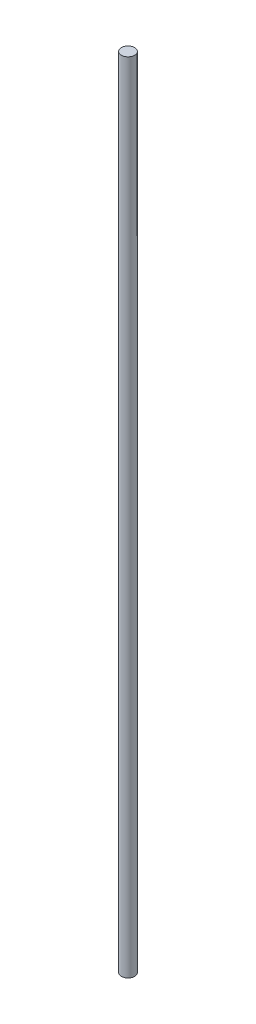
ISO-10303-21;
HEADER;
FILE_DESCRIPTION(('STEP AP214'),'2;1');
FILE_NAME('part.step','',(''),(''),'','','');
FILE_SCHEMA(('AUTOMOTIVE_DESIGN { 1 0 10303 214 1 1 1 1 }'));
ENDSEC;
DATA;
#1=APPLICATION_CONTEXT('core data for automotive mechanical design processes');
#2=APPLICATION_PROTOCOL_DEFINITION('international standard','automotive_design',2000,#1);
#3=PRODUCT_CONTEXT('',#1,'mechanical');
#4=PRODUCT('Part','Part','',(#3));
#5=PRODUCT_RELATED_PRODUCT_CATEGORY('part','',(#4));
#6=PRODUCT_DEFINITION_FORMATION('','',#4);
#7=PRODUCT_DEFINITION_CONTEXT('part definition',#1,'design');
#8=PRODUCT_DEFINITION('design','',#6,#7);
#9=PRODUCT_DEFINITION_SHAPE('','',#8);
#10=(LENGTH_UNIT() NAMED_UNIT(*) SI_UNIT(.MILLI.,.METRE.));
#11=(NAMED_UNIT(*) PLANE_ANGLE_UNIT() SI_UNIT($,.RADIAN.));
#12=(NAMED_UNIT(*) SI_UNIT($,.STERADIAN.) SOLID_ANGLE_UNIT());
#13=UNCERTAINTY_MEASURE_WITH_UNIT(LENGTH_MEASURE(1.E-05),#10,'distance_accuracy_value','');
#14=(GEOMETRIC_REPRESENTATION_CONTEXT(3) GLOBAL_UNCERTAINTY_ASSIGNED_CONTEXT((#13)) GLOBAL_UNIT_ASSIGNED_CONTEXT((#10,
#11,#12)) REPRESENTATION_CONTEXT('',''));
#15=CARTESIAN_POINT('',(0.,0.,0.));
#16=DIRECTION('',(0.,0.,1.));
#17=DIRECTION('',(1.,0.,0.));
#18=AXIS2_PLACEMENT_3D('',#15,#16,#17);
#19=CARTESIAN_POINT('',(0.,360.,0.));
#20=DIRECTION('',(0.,-1.,0.));
#21=DIRECTION('',(0.,0.,-1.));
#22=AXIS2_PLACEMENT_3D('',#19,#20,#21);
#23=CYLINDRICAL_SURFACE('',#22,3.);
#24=CARTESIAN_POINT('',(0.,360.,0.));
#25=DIRECTION('',(0.,1.,0.));
#26=DIRECTION('',(0.,0.,1.));
#27=AXIS2_PLACEMENT_3D('',#24,#25,#26);
#28=CIRCLE('',#27,3.);
#29=CARTESIAN_POINT('',(0.,360.,-3.));
#30=VERTEX_POINT('',#29);
#31=EDGE_CURVE('E10',#30,#30,#28,.T.);
#32=CARTESIAN_POINT('',(0.,0.,0.));
#33=DIRECTION('',(0.,1.,0.));
#34=DIRECTION('',(0.,0.,1.));
#35=AXIS2_PLACEMENT_3D('',#32,#33,#34);
#36=CIRCLE('',#35,3.);
#37=CARTESIAN_POINT('',(0.,0.,-3.));
#38=VERTEX_POINT('',#37);
#39=EDGE_CURVE('E40',#38,#38,#36,.T.);
#40=CARTESIAN_POINT('',(0.,360.,-3.));
#41=CARTESIAN_POINT('',(0.,356.25,-3.));
#42=CARTESIAN_POINT('',(0.,352.5,-3.));
#43=CARTESIAN_POINT('',(0.,345.,-3.));
#44=CARTESIAN_POINT('',(0.,341.25,-3.));
#45=CARTESIAN_POINT('',(0.,333.75,-3.));
#46=CARTESIAN_POINT('',(0.,330.,-3.));
#47=CARTESIAN_POINT('',(0.,322.5,-3.));
#48=CARTESIAN_POINT('',(0.,318.75,-3.));
#49=CARTESIAN_POINT('',(0.,311.25,-3.));
#50=CARTESIAN_POINT('',(0.,307.5,-3.));
#51=CARTESIAN_POINT('',(0.,300.,-3.));
#52=CARTESIAN_POINT('',(0.,296.25,-3.));
#53=CARTESIAN_POINT('',(0.,288.75,-3.));
#54=CARTESIAN_POINT('',(0.,285.,-3.));
#55=CARTESIAN_POINT('',(0.,277.5,-3.));
#56=CARTESIAN_POINT('',(0.,273.75,-3.));
#57=CARTESIAN_POINT('',(0.,266.25,-3.));
#58=CARTESIAN_POINT('',(0.,262.5,-3.));
#59=CARTESIAN_POINT('',(0.,255.,-3.));
#60=CARTESIAN_POINT('',(0.,251.25,-3.));
#61=CARTESIAN_POINT('',(0.,243.75,-3.));
#62=CARTESIAN_POINT('',(0.,240.,-3.));
#63=CARTESIAN_POINT('',(0.,232.5,-3.));
#64=CARTESIAN_POINT('',(0.,228.75,-3.));
#65=CARTESIAN_POINT('',(0.,221.25,-3.));
#66=CARTESIAN_POINT('',(0.,217.5,-3.));
#67=CARTESIAN_POINT('',(0.,210.,-3.));
#68=CARTESIAN_POINT('',(0.,206.25,-3.));
#69=CARTESIAN_POINT('',(0.,198.75,-3.));
#70=CARTESIAN_POINT('',(0.,195.,-3.));
#71=CARTESIAN_POINT('',(0.,187.5,-3.));
#72=CARTESIAN_POINT('',(0.,183.75,-3.));
#73=CARTESIAN_POINT('',(0.,176.25,-3.));
#74=CARTESIAN_POINT('',(0.,172.5,-3.));
#75=CARTESIAN_POINT('',(0.,165.,-3.));
#76=CARTESIAN_POINT('',(0.,161.25,-3.));
#77=CARTESIAN_POINT('',(0.,153.75,-3.));
#78=CARTESIAN_POINT('',(0.,150.,-3.));
#79=CARTESIAN_POINT('',(0.,142.5,-3.));
#80=CARTESIAN_POINT('',(0.,138.75,-3.));
#81=CARTESIAN_POINT('',(0.,131.25,-3.));
#82=CARTESIAN_POINT('',(0.,127.5,-3.));
#83=CARTESIAN_POINT('',(0.,120.,-3.));
#84=CARTESIAN_POINT('',(0.,116.25,-3.));
#85=CARTESIAN_POINT('',(0.,108.75,-3.));
#86=CARTESIAN_POINT('',(0.,105.,-3.));
#87=CARTESIAN_POINT('',(0.,97.5,-3.));
#88=CARTESIAN_POINT('',(0.,93.75,-3.));
#89=CARTESIAN_POINT('',(0.,86.25,-3.));
#90=CARTESIAN_POINT('',(0.,82.5,-3.));
#91=CARTESIAN_POINT('',(0.,75.,-3.));
#92=CARTESIAN_POINT('',(0.,71.25,-3.));
#93=CARTESIAN_POINT('',(0.,63.75,-3.));
#94=CARTESIAN_POINT('',(0.,60.,-3.));
#95=CARTESIAN_POINT('',(0.,52.5,-3.));
#96=CARTESIAN_POINT('',(0.,48.75,-3.));
#97=CARTESIAN_POINT('',(0.,41.25,-3.));
#98=CARTESIAN_POINT('',(0.,37.5,-3.));
#99=CARTESIAN_POINT('',(0.,30.,-3.));
#100=CARTESIAN_POINT('',(0.,26.25,-3.));
#101=CARTESIAN_POINT('',(0.,18.75,-3.));
#102=CARTESIAN_POINT('',(0.,14.9999999999999,-3.));
#103=CARTESIAN_POINT('',(0.,7.49999999999993,-3.));
#104=CARTESIAN_POINT('',(0.,3.74999999999994,-3.));
#105=CARTESIAN_POINT('',(0.,0.,-3.));
#106=B_SPLINE_CURVE_WITH_KNOTS('',3,(#40,#41,#42,#43,#44,#45,#46,#47,#48,#49,#50,#51,#52,#53,
#54,#55,#56,#57,#58,#59,#60,#61,#62,#63,#64,#65,#66,#67,#68,#69,#70,#71,#72,#73,#74,#75,#76,#77,
#78,#79,#80,#81,#82,#83,#84,#85,#86,#87,#88,#89,#90,#91,#92,#93,#94,#95,#96,#97,#98,#99,#100,
#101,#102,#103,#104,#105),.UNSPECIFIED.,.F.,.F.,(4,2,2,2,2,2,2,2,2,2,2,2,2,2,2,2,2,2,2,2,2,2,2,
2,2,2,2,2,2,2,2,2,4),(0.,11.25,22.5,33.7500000000001,45.,56.25,67.5,78.75,90.,101.25,112.5,
123.75,135.,146.25,157.5,168.75,180.,191.25,202.5,213.75,225.,236.25,247.5,258.75,270.,281.25,
292.5,303.75,315.,326.25,337.5,348.75,360.),.UNSPECIFIED.);
#107=EDGE_CURVE('BSEAM37',#30,#38,#106,.T.);
#108=ORIENTED_EDGE('',*,*,#31,.F.);
#109=ORIENTED_EDGE('',*,*,#39,.T.);
#110=ORIENTED_EDGE('',*,*,#107,.T.);
#111=ORIENTED_EDGE('',*,*,#107,.F.);
#112=EDGE_LOOP('',(#108,#110,#109,#111));
#113=FACE_BOUND('',#112,.T.);
#114=ADVANCED_FACE('F37',(#113),#23,.T.);
#115=CARTESIAN_POINT('',(0.,360.,0.));
#116=DIRECTION('',(0.,1.,0.));
#117=DIRECTION('',(0.,0.,1.));
#118=AXIS2_PLACEMENT_3D('',#115,#116,#117);
#119=PLANE('',#118);
#120=ORIENTED_EDGE('',*,*,#31,.T.);
#121=EDGE_LOOP('',(#120));
#122=FACE_BOUND('',#121,.T.);
#123=ADVANCED_FACE('F54',(#122),#119,.T.);
#124=CARTESIAN_POINT('',(0.,0.,0.));
#125=DIRECTION('',(0.,1.,0.));
#126=DIRECTION('',(0.,0.,1.));
#127=AXIS2_PLACEMENT_3D('',#124,#125,#126);
#128=PLANE('',#127);
#129=ORIENTED_EDGE('',*,*,#39,.F.);
#130=EDGE_LOOP('',(#129));
#131=FACE_BOUND('',#130,.T.);
#132=ADVANCED_FACE('F52',(#131),#128,.F.);
#133=CLOSED_SHELL('',(#114,#123,#132));
#134=MANIFOLD_SOLID_BREP('B2',#133);
#135=ADVANCED_BREP_SHAPE_REPRESENTATION('',(#18,#134),#14);
#136=SHAPE_DEFINITION_REPRESENTATION(#9,#135);
ENDSEC;
END-ISO-10303-21;
